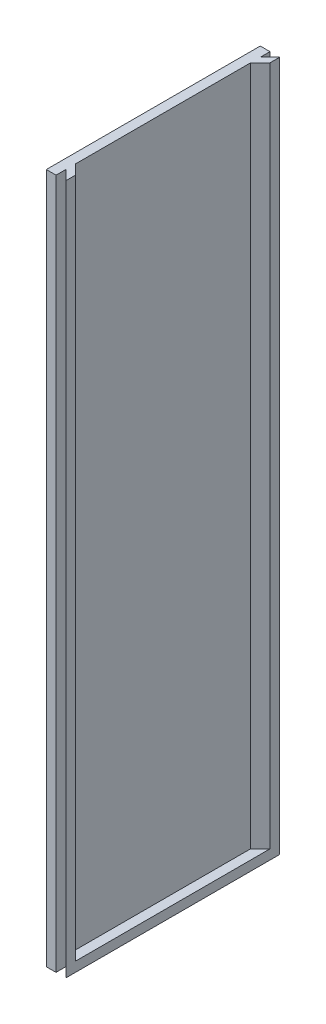
ISO-10303-21;
HEADER;
FILE_DESCRIPTION(('STEP AP214'),'2;1');
FILE_NAME('part.step','',(''),(''),'','','');
FILE_SCHEMA(('AUTOMOTIVE_DESIGN { 1 0 10303 214 1 1 1 1 }'));
ENDSEC;
DATA;
#1=APPLICATION_CONTEXT('core data for automotive mechanical design processes');
#2=APPLICATION_PROTOCOL_DEFINITION('international standard','automotive_design',2000,#1);
#3=PRODUCT_CONTEXT('',#1,'mechanical');
#4=PRODUCT('Part','Part','',(#3));
#5=PRODUCT_RELATED_PRODUCT_CATEGORY('part','',(#4));
#6=PRODUCT_DEFINITION_FORMATION('','',#4);
#7=PRODUCT_DEFINITION_CONTEXT('part definition',#1,'design');
#8=PRODUCT_DEFINITION('design','',#6,#7);
#9=PRODUCT_DEFINITION_SHAPE('','',#8);
#10=(LENGTH_UNIT() NAMED_UNIT(*) SI_UNIT(.MILLI.,.METRE.));
#11=(NAMED_UNIT(*) PLANE_ANGLE_UNIT() SI_UNIT($,.RADIAN.));
#12=(NAMED_UNIT(*) SI_UNIT($,.STERADIAN.) SOLID_ANGLE_UNIT());
#13=UNCERTAINTY_MEASURE_WITH_UNIT(LENGTH_MEASURE(1.E-05),#10,'distance_accuracy_value','');
#14=(GEOMETRIC_REPRESENTATION_CONTEXT(3) GLOBAL_UNCERTAINTY_ASSIGNED_CONTEXT((#13)) GLOBAL_UNIT_ASSIGNED_CONTEXT((#10,
#11,#12)) REPRESENTATION_CONTEXT('',''));
#15=CARTESIAN_POINT('',(0.,0.,0.));
#16=DIRECTION('',(0.,0.,1.));
#17=DIRECTION('',(1.,0.,0.));
#18=AXIS2_PLACEMENT_3D('',#15,#16,#17);
#19=CARTESIAN_POINT('',(0.,71.,8.99999999999999));
#20=DIRECTION('',(-0.707106781186552,0.,0.707106781186543));
#21=DIRECTION('',(0.707106781186543,0.,0.707106781186552));
#22=AXIS2_PLACEMENT_3D('',#19,#20,#21);
#23=PLANE('',#22);
#24=DIRECTION('',(-0.707106781186543,0.,-0.707106781186552));
#25=VECTOR('',#24,1.);
#26=CARTESIAN_POINT('',(1.,1.,10.));
#27=LINE('',#26,#25);
#28=CARTESIAN_POINT('',(1.,1.,10.));
#29=VERTEX_POINT('',#28);
#30=CARTESIAN_POINT('',(0.,1.,8.99999999999999));
#31=VERTEX_POINT('',#30);
#32=EDGE_CURVE('E69',#29,#31,#27,.T.);
#33=ORIENTED_EDGE('',*,*,#32,.T.);
#34=DIRECTION('',(0.,-1.,0.));
#35=VECTOR('',#34,1.);
#36=CARTESIAN_POINT('',(0.,71.,8.99999999999999));
#37=LINE('',#36,#35);
#38=CARTESIAN_POINT('',(0.,71.,8.99999999999999));
#39=VERTEX_POINT('',#38);
#40=EDGE_CURVE('E219',#39,#31,#37,.T.);
#41=ORIENTED_EDGE('',*,*,#40,.F.);
#42=DIRECTION('',(-0.707106781186543,0.,-0.707106781186552));
#43=VECTOR('',#42,1.);
#44=CARTESIAN_POINT('',(0.,71.,8.99999999999999));
#45=LINE('',#44,#43);
#46=CARTESIAN_POINT('',(1.,71.,10.));
#47=VERTEX_POINT('',#46);
#48=EDGE_CURVE('E251',#47,#39,#45,.T.);
#49=ORIENTED_EDGE('',*,*,#48,.F.);
#50=DIRECTION('',(0.,-1.,0.));
#51=VECTOR('',#50,1.);
#52=CARTESIAN_POINT('',(1.,71.,10.));
#53=LINE('',#52,#51);
#54=EDGE_CURVE('E65',#47,#29,#53,.T.);
#55=ORIENTED_EDGE('',*,*,#54,.T.);
#56=EDGE_LOOP('',(#33,#41,#49,#55));
#57=FACE_BOUND('',#56,.T.);
#58=ADVANCED_FACE('F49',(#57),#23,.F.);
#59=CARTESIAN_POINT('',(0.,71.,-8.99999999999999));
#60=DIRECTION('',(-1.,0.,0.));
#61=DIRECTION('',(0.,0.,1.));
#62=AXIS2_PLACEMENT_3D('',#59,#60,#61);
#63=PLANE('',#62);
#64=DIRECTION('',(0.,0.,-1.));
#65=VECTOR('',#64,1.);
#66=CARTESIAN_POINT('',(0.,1.,8.99999999999999));
#67=LINE('',#66,#65);
#68=CARTESIAN_POINT('',(0.,1.,-8.99999999999999));
#69=VERTEX_POINT('',#68);
#70=EDGE_CURVE('E298',#31,#69,#67,.T.);
#71=ORIENTED_EDGE('',*,*,#70,.T.);
#72=DIRECTION('',(0.,-1.,0.));
#73=VECTOR('',#72,1.);
#74=CARTESIAN_POINT('',(0.,71.,-8.99999999999999));
#75=LINE('',#74,#73);
#76=CARTESIAN_POINT('',(0.,71.,-8.99999999999999));
#77=VERTEX_POINT('',#76);
#78=EDGE_CURVE('E216',#77,#69,#75,.T.);
#79=ORIENTED_EDGE('',*,*,#78,.F.);
#80=DIRECTION('',(0.,0.,-1.));
#81=VECTOR('',#80,1.);
#82=CARTESIAN_POINT('',(0.,71.,-8.99999999999999));
#83=LINE('',#82,#81);
#84=EDGE_CURVE('E256',#39,#77,#83,.T.);
#85=ORIENTED_EDGE('',*,*,#84,.F.);
#86=ORIENTED_EDGE('',*,*,#40,.T.);
#87=EDGE_LOOP('',(#71,#79,#85,#86));
#88=FACE_BOUND('',#87,.T.);
#89=ADVANCED_FACE('F320',(#88),#63,.F.);
#90=CARTESIAN_POINT('',(0.,71.,-8.99999999999999));
#91=DIRECTION('',(-0.707106781186552,0.,-0.707106781186543));
#92=DIRECTION('',(-0.707106781186543,0.,0.707106781186552));
#93=AXIS2_PLACEMENT_3D('',#90,#91,#92);
#94=PLANE('',#93);
#95=DIRECTION('',(0.707106781186543,0.,-0.707106781186552));
#96=VECTOR('',#95,1.);
#97=CARTESIAN_POINT('',(0.,1.,-8.99999999999999));
#98=LINE('',#97,#96);
#99=CARTESIAN_POINT('',(1.,1.,-10.));
#100=VERTEX_POINT('',#99);
#101=EDGE_CURVE('E176',#69,#100,#98,.T.);
#102=ORIENTED_EDGE('',*,*,#101,.T.);
#103=DIRECTION('',(0.,-1.,0.));
#104=VECTOR('',#103,1.);
#105=CARTESIAN_POINT('',(1.,71.,-10.));
#106=LINE('',#105,#104);
#107=CARTESIAN_POINT('',(1.,71.,-10.));
#108=VERTEX_POINT('',#107);
#109=EDGE_CURVE('E212',#108,#100,#106,.T.);
#110=ORIENTED_EDGE('',*,*,#109,.F.);
#111=DIRECTION('',(0.707106781186543,0.,-0.707106781186552));
#112=VECTOR('',#111,1.);
#113=CARTESIAN_POINT('',(0.,71.,-8.99999999999999));
#114=LINE('',#113,#112);
#115=EDGE_CURVE('E264',#77,#108,#114,.T.);
#116=ORIENTED_EDGE('',*,*,#115,.F.);
#117=ORIENTED_EDGE('',*,*,#78,.T.);
#118=EDGE_LOOP('',(#102,#110,#116,#117));
#119=FACE_BOUND('',#118,.T.);
#120=ADVANCED_FACE('F326',(#119),#94,.F.);
#121=CARTESIAN_POINT('',(-0.999999999999997,71.,11.));
#122=DIRECTION('',(1.,0.,0.));
#123=DIRECTION('',(0.,0.,-1.));
#124=AXIS2_PLACEMENT_3D('',#121,#122,#123);
#125=PLANE('',#124);
#126=DIRECTION('',(0.,0.,1.));
#127=VECTOR('',#126,1.);
#128=CARTESIAN_POINT('',(-0.999999999999997,0.,11.));
#129=LINE('',#128,#127);
#130=CARTESIAN_POINT('',(-0.999999999999997,0.,-11.));
#131=VERTEX_POINT('',#130);
#132=CARTESIAN_POINT('',(-0.999999999999997,0.,11.));
#133=VERTEX_POINT('',#132);
#134=EDGE_CURVE('E161',#131,#133,#129,.T.);
#135=ORIENTED_EDGE('',*,*,#134,.T.);
#136=DIRECTION('',(0.,-1.,0.));
#137=VECTOR('',#136,1.);
#138=CARTESIAN_POINT('',(-0.999999999999997,71.,11.));
#139=LINE('',#138,#137);
#140=CARTESIAN_POINT('',(-0.999999999999997,71.,11.));
#141=VERTEX_POINT('',#140);
#142=EDGE_CURVE('E11',#141,#133,#139,.T.);
#143=ORIENTED_EDGE('',*,*,#142,.F.);
#144=DIRECTION('',(0.,0.,1.));
#145=VECTOR('',#144,1.);
#146=CARTESIAN_POINT('',(-0.999999999999997,71.,11.));
#147=LINE('',#146,#145);
#148=CARTESIAN_POINT('',(-0.999999999999997,71.,-11.));
#149=VERTEX_POINT('',#148);
#150=EDGE_CURVE('E148',#149,#141,#147,.T.);
#151=ORIENTED_EDGE('',*,*,#150,.F.);
#152=DIRECTION('',(0.,-1.,0.));
#153=VECTOR('',#152,1.);
#154=CARTESIAN_POINT('',(-0.999999999999997,71.,-11.));
#155=LINE('',#154,#153);
#156=EDGE_CURVE('E162',#149,#131,#155,.T.);
#157=ORIENTED_EDGE('',*,*,#156,.T.);
#158=EDGE_LOOP('',(#135,#143,#151,#157));
#159=FACE_BOUND('',#158,.T.);
#160=ADVANCED_FACE('F51',(#159),#125,.F.);
#161=CARTESIAN_POINT('',(-0.999999999999997,71.,11.));
#162=DIRECTION('',(0.,0.,-1.));
#163=DIRECTION('',(-1.,0.,0.));
#164=AXIS2_PLACEMENT_3D('',#161,#162,#163);
#165=PLANE('',#164);
#166=DIRECTION('',(1.,0.,0.));
#167=VECTOR('',#166,1.);
#168=CARTESIAN_POINT('',(-0.999999999999997,0.,11.));
#169=LINE('',#168,#167);
#170=CARTESIAN_POINT('',(0.,0.,11.));
#171=VERTEX_POINT('',#170);
#172=EDGE_CURVE('E166',#133,#171,#169,.T.);
#173=ORIENTED_EDGE('',*,*,#172,.T.);
#174=DIRECTION('',(0.,-1.,0.));
#175=VECTOR('',#174,1.);
#176=CARTESIAN_POINT('',(0.,71.,11.));
#177=LINE('',#176,#175);
#178=CARTESIAN_POINT('',(0.,71.,11.));
#179=VERTEX_POINT('',#178);
#180=EDGE_CURVE('E58',#179,#171,#177,.T.);
#181=ORIENTED_EDGE('',*,*,#180,.F.);
#182=DIRECTION('',(1.,0.,0.));
#183=VECTOR('',#182,1.);
#184=CARTESIAN_POINT('',(-0.999999999999997,71.,11.));
#185=LINE('',#184,#183);
#186=EDGE_CURVE('E138',#141,#179,#185,.T.);
#187=ORIENTED_EDGE('',*,*,#186,.F.);
#188=ORIENTED_EDGE('',*,*,#142,.T.);
#189=EDGE_LOOP('',(#173,#181,#187,#188));
#190=FACE_BOUND('',#189,.T.);
#191=ADVANCED_FACE('F140',(#190),#165,.F.);
#192=CARTESIAN_POINT('',(0.,71.,9.99999999999999));
#193=DIRECTION('',(-1.,0.,0.));
#194=DIRECTION('',(0.,0.,1.));
#195=AXIS2_PLACEMENT_3D('',#192,#193,#194);
#196=PLANE('',#195);
#197=DIRECTION('',(0.,0.,-1.));
#198=VECTOR('',#197,1.);
#199=CARTESIAN_POINT('',(0.,0.,9.99999999999999));
#200=LINE('',#199,#198);
#201=CARTESIAN_POINT('',(0.,0.,9.99999999999999));
#202=VERTEX_POINT('',#201);
#203=EDGE_CURVE('E172',#171,#202,#200,.T.);
#204=ORIENTED_EDGE('',*,*,#203,.T.);
#205=DIRECTION('',(0.,-1.,0.));
#206=VECTOR('',#205,1.);
#207=CARTESIAN_POINT('',(0.,71.,9.99999999999999));
#208=LINE('',#207,#206);
#209=CARTESIAN_POINT('',(0.,71.,9.99999999999999));
#210=VERTEX_POINT('',#209);
#211=EDGE_CURVE('E228',#210,#202,#208,.T.);
#212=ORIENTED_EDGE('',*,*,#211,.F.);
#213=DIRECTION('',(0.,0.,-1.));
#214=VECTOR('',#213,1.);
#215=CARTESIAN_POINT('',(0.,71.,9.99999999999999));
#216=LINE('',#215,#214);
#217=EDGE_CURVE('E147',#179,#210,#216,.T.);
#218=ORIENTED_EDGE('',*,*,#217,.F.);
#219=ORIENTED_EDGE('',*,*,#180,.T.);
#220=EDGE_LOOP('',(#204,#212,#218,#219));
#221=FACE_BOUND('',#220,.T.);
#222=ADVANCED_FACE('F236',(#221),#196,.F.);
#223=CARTESIAN_POINT('',(0.,71.,9.99999999999999));
#224=DIRECTION('',(0.707106781186552,0.,-0.707106781186543));
#225=DIRECTION('',(-0.707106781186543,0.,-0.707106781186552));
#226=AXIS2_PLACEMENT_3D('',#223,#224,#225);
#227=PLANE('',#226);
#228=DIRECTION('',(0.707106781186543,0.,0.707106781186552));
#229=VECTOR('',#228,1.);
#230=CARTESIAN_POINT('',(0.,0.,9.99999999999999));
#231=LINE('',#230,#229);
#232=CARTESIAN_POINT('',(1.,0.,11.));
#233=VERTEX_POINT('',#232);
#234=EDGE_CURVE('E183',#202,#233,#231,.T.);
#235=ORIENTED_EDGE('',*,*,#234,.T.);
#236=DIRECTION('',(0.,-1.,0.));
#237=VECTOR('',#236,1.);
#238=CARTESIAN_POINT('',(1.,71.,11.));
#239=LINE('',#238,#237);
#240=CARTESIAN_POINT('',(1.,71.,11.));
#241=VERTEX_POINT('',#240);
#242=EDGE_CURVE('E224',#241,#233,#239,.T.);
#243=ORIENTED_EDGE('',*,*,#242,.F.);
#244=DIRECTION('',(0.707106781186543,0.,0.707106781186552));
#245=VECTOR('',#244,1.);
#246=CARTESIAN_POINT('',(0.,71.,9.99999999999999));
#247=LINE('',#246,#245);
#248=EDGE_CURVE('E252',#210,#241,#247,.T.);
#249=ORIENTED_EDGE('',*,*,#248,.F.);
#250=ORIENTED_EDGE('',*,*,#211,.T.);
#251=EDGE_LOOP('',(#235,#243,#249,#250));
#252=FACE_BOUND('',#251,.T.);
#253=ADVANCED_FACE('F243',(#252),#227,.F.);
#254=CARTESIAN_POINT('',(1.,71.,-11.));
#255=DIRECTION('',(-1.,0.,0.));
#256=DIRECTION('',(0.,0.,1.));
#257=AXIS2_PLACEMENT_3D('',#254,#255,#256);
#258=PLANE('',#257);
#259=DIRECTION('',(0.,0.,-1.));
#260=VECTOR('',#259,1.);
#261=CARTESIAN_POINT('',(1.,0.,-11.));
#262=LINE('',#261,#260);
#263=CARTESIAN_POINT('',(1.,0.,-11.));
#264=VERTEX_POINT('',#263);
#265=EDGE_CURVE('E187',#233,#264,#262,.T.);
#266=ORIENTED_EDGE('',*,*,#265,.T.);
#267=DIRECTION('',(0.,-1.,0.));
#268=VECTOR('',#267,1.);
#269=CARTESIAN_POINT('',(1.,71.,-11.));
#270=LINE('',#269,#268);
#271=CARTESIAN_POINT('',(1.,71.,-11.));
#272=VERTEX_POINT('',#271);
#273=EDGE_CURVE('E208',#272,#264,#270,.T.);
#274=ORIENTED_EDGE('',*,*,#273,.F.);
#275=DIRECTION('',(0.,0.,-1.));
#276=VECTOR('',#275,1.);
#277=CARTESIAN_POINT('',(1.,71.,-11.));
#278=LINE('',#277,#276);
#279=EDGE_CURVE('E267',#108,#272,#278,.T.);
#280=ORIENTED_EDGE('',*,*,#279,.F.);
#281=ORIENTED_EDGE('',*,*,#109,.T.);
#282=DIRECTION('',(0.,0.,1.));
#283=VECTOR('',#282,1.);
#284=CARTESIAN_POINT('',(1.,1.,10.));
#285=LINE('',#284,#283);
#286=EDGE_CURVE('E167',#100,#29,#285,.T.);
#287=ORIENTED_EDGE('',*,*,#286,.T.);
#288=ORIENTED_EDGE('',*,*,#54,.F.);
#289=DIRECTION('',(0.,0.,-1.));
#290=VECTOR('',#289,1.);
#291=CARTESIAN_POINT('',(1.,71.,11.));
#292=LINE('',#291,#290);
#293=EDGE_CURVE('E249',#241,#47,#292,.T.);
#294=ORIENTED_EDGE('',*,*,#293,.F.);
#295=ORIENTED_EDGE('',*,*,#242,.T.);
#296=EDGE_LOOP('',(#266,#274,#280,#281,#287,#288,#294,#295));
#297=FACE_BOUND('',#296,.T.);
#298=ADVANCED_FACE('F247',(#297),#258,.F.);
#299=CARTESIAN_POINT('',(0.,71.,-9.99999999999999));
#300=DIRECTION('',(0.707106781186552,0.,0.707106781186543));
#301=DIRECTION('',(0.707106781186543,0.,-0.707106781186552));
#302=AXIS2_PLACEMENT_3D('',#299,#300,#301);
#303=PLANE('',#302);
#304=DIRECTION('',(-0.707106781186543,0.,0.707106781186552));
#305=VECTOR('',#304,1.);
#306=CARTESIAN_POINT('',(0.,0.,-9.99999999999999));
#307=LINE('',#306,#305);
#308=CARTESIAN_POINT('',(0.,0.,-9.99999999999999));
#309=VERTEX_POINT('',#308);
#310=EDGE_CURVE('E190',#264,#309,#307,.T.);
#311=ORIENTED_EDGE('',*,*,#310,.T.);
#312=DIRECTION('',(0.,-1.,0.));
#313=VECTOR('',#312,1.);
#314=CARTESIAN_POINT('',(0.,71.,-9.99999999999999));
#315=LINE('',#314,#313);
#316=CARTESIAN_POINT('',(0.,71.,-9.99999999999999));
#317=VERTEX_POINT('',#316);
#318=EDGE_CURVE('E204',#317,#309,#315,.T.);
#319=ORIENTED_EDGE('',*,*,#318,.F.);
#320=DIRECTION('',(-0.707106781186543,0.,0.707106781186552));
#321=VECTOR('',#320,1.);
#322=CARTESIAN_POINT('',(0.,71.,-9.99999999999999));
#323=LINE('',#322,#321);
#324=EDGE_CURVE('E270',#272,#317,#323,.T.);
#325=ORIENTED_EDGE('',*,*,#324,.F.);
#326=ORIENTED_EDGE('',*,*,#273,.T.);
#327=EDGE_LOOP('',(#311,#319,#325,#326));
#328=FACE_BOUND('',#327,.T.);
#329=ADVANCED_FACE('F352',(#328),#303,.F.);
#330=CARTESIAN_POINT('',(0.,71.,-11.));
#331=DIRECTION('',(-1.,0.,0.));
#332=DIRECTION('',(0.,0.,1.));
#333=AXIS2_PLACEMENT_3D('',#330,#331,#332);
#334=PLANE('',#333);
#335=DIRECTION('',(0.,0.,-1.));
#336=VECTOR('',#335,1.);
#337=CARTESIAN_POINT('',(0.,0.,-11.));
#338=LINE('',#337,#336);
#339=CARTESIAN_POINT('',(0.,0.,-11.));
#340=VERTEX_POINT('',#339);
#341=EDGE_CURVE('E193',#309,#340,#338,.T.);
#342=ORIENTED_EDGE('',*,*,#341,.T.);
#343=DIRECTION('',(0.,-1.,0.));
#344=VECTOR('',#343,1.);
#345=CARTESIAN_POINT('',(0.,71.,-11.));
#346=LINE('',#345,#344);
#347=CARTESIAN_POINT('',(0.,71.,-11.));
#348=VERTEX_POINT('',#347);
#349=EDGE_CURVE('E200',#348,#340,#346,.T.);
#350=ORIENTED_EDGE('',*,*,#349,.F.);
#351=DIRECTION('',(0.,0.,-1.));
#352=VECTOR('',#351,1.);
#353=CARTESIAN_POINT('',(0.,71.,-11.));
#354=LINE('',#353,#352);
#355=EDGE_CURVE('E272',#317,#348,#354,.T.);
#356=ORIENTED_EDGE('',*,*,#355,.F.);
#357=ORIENTED_EDGE('',*,*,#318,.T.);
#358=EDGE_LOOP('',(#342,#350,#356,#357));
#359=FACE_BOUND('',#358,.T.);
#360=ADVANCED_FACE('F355',(#359),#334,.F.);
#361=CARTESIAN_POINT('',(-0.999999999999997,71.,-11.));
#362=DIRECTION('',(0.,0.,1.));
#363=DIRECTION('',(1.,0.,0.));
#364=AXIS2_PLACEMENT_3D('',#361,#362,#363);
#365=PLANE('',#364);
#366=DIRECTION('',(-1.,0.,0.));
#367=VECTOR('',#366,1.);
#368=CARTESIAN_POINT('',(-0.999999999999997,0.,-11.));
#369=LINE('',#368,#367);
#370=EDGE_CURVE('E158',#340,#131,#369,.T.);
#371=ORIENTED_EDGE('',*,*,#370,.T.);
#372=ORIENTED_EDGE('',*,*,#156,.F.);
#373=DIRECTION('',(-1.,0.,0.));
#374=VECTOR('',#373,1.);
#375=CARTESIAN_POINT('',(-0.999999999999997,71.,-11.));
#376=LINE('',#375,#374);
#377=EDGE_CURVE('E153',#348,#149,#376,.T.);
#378=ORIENTED_EDGE('',*,*,#377,.F.);
#379=ORIENTED_EDGE('',*,*,#349,.T.);
#380=EDGE_LOOP('',(#371,#372,#378,#379));
#381=FACE_BOUND('',#380,.T.);
#382=ADVANCED_FACE('F359',(#381),#365,.F.);
#383=CARTESIAN_POINT('',(0.,71.,0.));
#384=DIRECTION('',(0.,-1.,0.));
#385=DIRECTION('',(0.,0.,-1.));
#386=AXIS2_PLACEMENT_3D('',#383,#384,#385);
#387=PLANE('',#386);
#388=ORIENTED_EDGE('',*,*,#150,.T.);
#389=ORIENTED_EDGE('',*,*,#186,.T.);
#390=ORIENTED_EDGE('',*,*,#217,.T.);
#391=ORIENTED_EDGE('',*,*,#248,.T.);
#392=ORIENTED_EDGE('',*,*,#293,.T.);
#393=ORIENTED_EDGE('',*,*,#48,.T.);
#394=ORIENTED_EDGE('',*,*,#84,.T.);
#395=ORIENTED_EDGE('',*,*,#115,.T.);
#396=ORIENTED_EDGE('',*,*,#279,.T.);
#397=ORIENTED_EDGE('',*,*,#324,.T.);
#398=ORIENTED_EDGE('',*,*,#355,.T.);
#399=ORIENTED_EDGE('',*,*,#377,.T.);
#400=EDGE_LOOP('',(#388,#389,#390,#391,#392,#393,#394,#395,#396,#397,#398,#399));
#401=FACE_BOUND('',#400,.T.);
#402=ADVANCED_FACE('F151',(#401),#387,.F.);
#403=CARTESIAN_POINT('',(0.,0.,0.));
#404=DIRECTION('',(0.,-1.,0.));
#405=DIRECTION('',(0.,0.,-1.));
#406=AXIS2_PLACEMENT_3D('',#403,#404,#405);
#407=PLANE('',#406);
#408=ORIENTED_EDGE('',*,*,#265,.F.);
#409=ORIENTED_EDGE('',*,*,#234,.F.);
#410=ORIENTED_EDGE('',*,*,#203,.F.);
#411=ORIENTED_EDGE('',*,*,#172,.F.);
#412=ORIENTED_EDGE('',*,*,#134,.F.);
#413=ORIENTED_EDGE('',*,*,#370,.F.);
#414=ORIENTED_EDGE('',*,*,#341,.F.);
#415=ORIENTED_EDGE('',*,*,#310,.F.);
#416=EDGE_LOOP('',(#408,#409,#410,#411,#412,#413,#414,#415));
#417=FACE_BOUND('',#416,.T.);
#418=ADVANCED_FACE('F239',(#417),#407,.T.);
#419=CARTESIAN_POINT('',(0.,1.,0.));
#420=DIRECTION('',(0.,-1.,0.));
#421=DIRECTION('',(0.,0.,-1.));
#422=AXIS2_PLACEMENT_3D('',#419,#420,#421);
#423=PLANE('',#422);
#424=ORIENTED_EDGE('',*,*,#32,.F.);
#425=ORIENTED_EDGE('',*,*,#286,.F.);
#426=ORIENTED_EDGE('',*,*,#101,.F.);
#427=ORIENTED_EDGE('',*,*,#70,.F.);
#428=EDGE_LOOP('',(#424,#425,#426,#427));
#429=FACE_BOUND('',#428,.T.);
#430=ADVANCED_FACE('F329',(#429),#423,.F.);
#431=CLOSED_SHELL('',(#58,#89,#120,#160,#191,#222,#253,#298,#329,#360,#382,#402,#418,#430));
#432=MANIFOLD_SOLID_BREP('B2',#431);
#433=ADVANCED_BREP_SHAPE_REPRESENTATION('',(#18,#432),#14);
#434=SHAPE_DEFINITION_REPRESENTATION(#9,#433);
ENDSEC;
END-ISO-10303-21;
